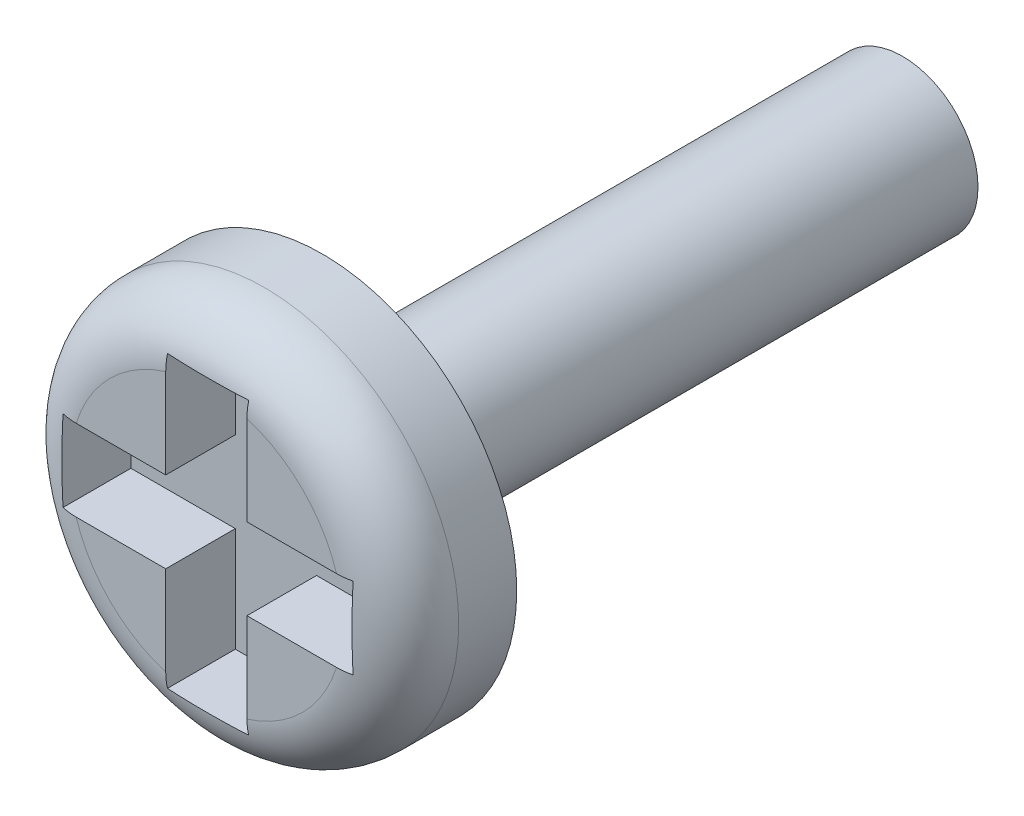
ISO-10303-21;
HEADER;
FILE_DESCRIPTION(('STEP AP214'),'2;1');
FILE_NAME('part.step','',(''),(''),'','','');
FILE_SCHEMA(('AUTOMOTIVE_DESIGN { 1 0 10303 214 1 1 1 1 }'));
ENDSEC;
DATA;
#1=APPLICATION_CONTEXT('core data for automotive mechanical design processes');
#2=APPLICATION_PROTOCOL_DEFINITION('international standard','automotive_design',2000,#1);
#3=PRODUCT_CONTEXT('',#1,'mechanical');
#4=PRODUCT('Part','Part','',(#3));
#5=PRODUCT_RELATED_PRODUCT_CATEGORY('part','',(#4));
#6=PRODUCT_DEFINITION_FORMATION('','',#4);
#7=PRODUCT_DEFINITION_CONTEXT('part definition',#1,'design');
#8=PRODUCT_DEFINITION('design','',#6,#7);
#9=PRODUCT_DEFINITION_SHAPE('','',#8);
#10=(LENGTH_UNIT() NAMED_UNIT(*) SI_UNIT(.MILLI.,.METRE.));
#11=(NAMED_UNIT(*) PLANE_ANGLE_UNIT() SI_UNIT($,.RADIAN.));
#12=(NAMED_UNIT(*) SI_UNIT($,.STERADIAN.) SOLID_ANGLE_UNIT());
#13=UNCERTAINTY_MEASURE_WITH_UNIT(LENGTH_MEASURE(1.E-05),#10,'distance_accuracy_value','');
#14=(GEOMETRIC_REPRESENTATION_CONTEXT(3) GLOBAL_UNCERTAINTY_ASSIGNED_CONTEXT((#13)) GLOBAL_UNIT_ASSIGNED_CONTEXT((#10,
#11,#12)) REPRESENTATION_CONTEXT('',''));
#15=CARTESIAN_POINT('',(0.,0.,0.));
#16=DIRECTION('',(0.,0.,1.));
#17=DIRECTION('',(1.,0.,0.));
#18=AXIS2_PLACEMENT_3D('',#15,#16,#17);
#19=CARTESIAN_POINT('',(0.,0.,6.));
#20=DIRECTION('',(0.,0.,1.));
#21=DIRECTION('',(1.,0.,0.));
#22=AXIS2_PLACEMENT_3D('',#19,#20,#21);
#23=PLANE('',#22);
#24=DIRECTION('',(0.,-1.,0.));
#25=VECTOR('',#24,1.);
#26=CARTESIAN_POINT('',(-0.35,0.35,6.));
#27=LINE('',#26,#25);
#28=CARTESIAN_POINT('',(-0.35,1.12166171370873,6.));
#29=VERTEX_POINT('',#28);
#30=CARTESIAN_POINT('',(-0.35,0.35,6.));
#31=VERTEX_POINT('',#30);
#32=EDGE_CURVE('E200',#29,#31,#27,.T.);
#33=ORIENTED_EDGE('',*,*,#32,.F.);
#34=CARTESIAN_POINT('',(0.,0.,6.));
#35=DIRECTION('',(0.,0.,1.));
#36=DIRECTION('',(1.,0.,0.));
#37=AXIS2_PLACEMENT_3D('',#34,#35,#36);
#38=CIRCLE('',#37,1.175);
#39=CARTESIAN_POINT('',(-1.12166171370873,0.35,6.));
#40=VERTEX_POINT('',#39);
#41=EDGE_CURVE('E259',#29,#40,#38,.T.);
#42=ORIENTED_EDGE('',*,*,#41,.T.);
#43=DIRECTION('',(-1.,0.,0.));
#44=VECTOR('',#43,1.);
#45=CARTESIAN_POINT('',(-1.25,0.35,6.));
#46=LINE('',#45,#44);
#47=EDGE_CURVE('E202',#31,#40,#46,.T.);
#48=ORIENTED_EDGE('',*,*,#47,.F.);
#49=EDGE_LOOP('',(#33,#42,#48));
#50=FACE_BOUND('',#49,.T.);
#51=ADVANCED_FACE('F34',(#50),#23,.T.);
#52=DIRECTION('',(1.,0.,0.));
#53=VECTOR('',#52,1.);
#54=CARTESIAN_POINT('',(-1.25,-0.35,6.));
#55=LINE('',#54,#53);
#56=CARTESIAN_POINT('',(-1.12166171370873,-0.35,6.));
#57=VERTEX_POINT('',#56);
#58=CARTESIAN_POINT('',(-0.35,-0.35,6.));
#59=VERTEX_POINT('',#58);
#60=EDGE_CURVE('E205',#57,#59,#55,.T.);
#61=ORIENTED_EDGE('',*,*,#60,.F.);
#62=CARTESIAN_POINT('',(0.,0.,6.));
#63=DIRECTION('',(0.,0.,1.));
#64=DIRECTION('',(1.,0.,0.));
#65=AXIS2_PLACEMENT_3D('',#62,#63,#64);
#66=CIRCLE('',#65,1.175);
#67=CARTESIAN_POINT('',(-0.35,-1.12166171370873,6.));
#68=VERTEX_POINT('',#67);
#69=EDGE_CURVE('E257',#57,#68,#66,.T.);
#70=ORIENTED_EDGE('',*,*,#69,.T.);
#71=DIRECTION('',(0.,-1.,0.));
#72=VECTOR('',#71,1.);
#73=CARTESIAN_POINT('',(-0.35,-1.25,6.));
#74=LINE('',#73,#72);
#75=EDGE_CURVE('E207',#59,#68,#74,.T.);
#76=ORIENTED_EDGE('',*,*,#75,.F.);
#77=EDGE_LOOP('',(#61,#70,#76));
#78=FACE_BOUND('',#77,.T.);
#79=ADVANCED_FACE('F339',(#78),#23,.T.);
#80=DIRECTION('',(0.,1.,0.));
#81=VECTOR('',#80,1.);
#82=CARTESIAN_POINT('',(0.35,-1.25,6.));
#83=LINE('',#82,#81);
#84=CARTESIAN_POINT('',(0.35,-1.12166171370873,6.));
#85=VERTEX_POINT('',#84);
#86=CARTESIAN_POINT('',(0.35,-0.35,6.));
#87=VERTEX_POINT('',#86);
#88=EDGE_CURVE('E210',#85,#87,#83,.T.);
#89=ORIENTED_EDGE('',*,*,#88,.F.);
#90=CARTESIAN_POINT('',(0.,0.,6.));
#91=DIRECTION('',(0.,0.,1.));
#92=DIRECTION('',(1.,0.,0.));
#93=AXIS2_PLACEMENT_3D('',#90,#91,#92);
#94=CIRCLE('',#93,1.175);
#95=CARTESIAN_POINT('',(1.12166171370873,-0.35,6.));
#96=VERTEX_POINT('',#95);
#97=EDGE_CURVE('E255',#85,#96,#94,.T.);
#98=ORIENTED_EDGE('',*,*,#97,.T.);
#99=DIRECTION('',(1.,0.,0.));
#100=VECTOR('',#99,1.);
#101=CARTESIAN_POINT('',(0.35,-0.35,6.));
#102=LINE('',#101,#100);
#103=EDGE_CURVE('E170',#87,#96,#102,.T.);
#104=ORIENTED_EDGE('',*,*,#103,.F.);
#105=EDGE_LOOP('',(#89,#98,#104));
#106=FACE_BOUND('',#105,.T.);
#107=ADVANCED_FACE('F323',(#106),#23,.T.);
#108=CARTESIAN_POINT('',(0.,0.,5.));
#109=DIRECTION('',(0.,0.,-1.));
#110=DIRECTION('',(-1.,0.,0.));
#111=AXIS2_PLACEMENT_3D('',#108,#109,#110);
#112=CYLINDRICAL_SURFACE('',#111,0.65);
#113=CARTESIAN_POINT('',(0.,0.,5.));
#114=DIRECTION('',(0.,0.,1.));
#115=DIRECTION('',(1.,0.,0.));
#116=AXIS2_PLACEMENT_3D('',#113,#114,#115);
#117=CIRCLE('',#116,0.65);
#118=CARTESIAN_POINT('',(0.65,0.,5.));
#119=VERTEX_POINT('',#118);
#120=EDGE_CURVE('E248',#119,#119,#117,.T.);
#121=ORIENTED_EDGE('',*,*,#120,.F.);
#122=EDGE_LOOP('',(#121));
#123=FACE_BOUND('',#122,.T.);
#124=CARTESIAN_POINT('',(0.,0.,0.));
#125=DIRECTION('',(0.,0.,1.));
#126=DIRECTION('',(1.,0.,0.));
#127=AXIS2_PLACEMENT_3D('',#124,#125,#126);
#128=CIRCLE('',#127,0.65);
#129=CARTESIAN_POINT('',(0.65,0.,0.));
#130=VERTEX_POINT('',#129);
#131=EDGE_CURVE('E247',#130,#130,#128,.T.);
#132=ORIENTED_EDGE('',*,*,#131,.T.);
#133=EDGE_LOOP('',(#132));
#134=FACE_BOUND('',#133,.T.);
#135=ADVANCED_FACE('F332',(#123,#134),#112,.T.);
#136=CARTESIAN_POINT('',(0.,0.,0.));
#137=DIRECTION('',(0.,0.,1.));
#138=DIRECTION('',(1.,0.,0.));
#139=AXIS2_PLACEMENT_3D('',#136,#137,#138);
#140=PLANE('',#139);
#141=ORIENTED_EDGE('',*,*,#131,.F.);
#142=EDGE_LOOP('',(#141));
#143=FACE_BOUND('',#142,.T.);
#144=ADVANCED_FACE('F329',(#143),#140,.F.);
#145=CARTESIAN_POINT('',(0.,0.,6.));
#146=DIRECTION('',(0.,0.,-1.));
#147=DIRECTION('',(-1.,0.,0.));
#148=AXIS2_PLACEMENT_3D('',#145,#146,#147);
#149=CYLINDRICAL_SURFACE('',#148,1.675);
#150=CARTESIAN_POINT('',(0.,0.,5.5));
#151=DIRECTION('',(0.,0.,1.));
#152=DIRECTION('',(1.,0.,0.));
#153=AXIS2_PLACEMENT_3D('',#150,#151,#152);
#154=CIRCLE('',#153,1.675);
#155=CARTESIAN_POINT('',(1.675,0.,5.5));
#156=VERTEX_POINT('',#155);
#157=EDGE_CURVE('E11',#156,#156,#154,.F.);
#158=ORIENTED_EDGE('',*,*,#157,.T.);
#159=EDGE_LOOP('',(#158));
#160=FACE_BOUND('',#159,.T.);
#161=CARTESIAN_POINT('',(0.,0.,5.));
#162=DIRECTION('',(0.,0.,1.));
#163=DIRECTION('',(1.,0.,0.));
#164=AXIS2_PLACEMENT_3D('',#161,#162,#163);
#165=CIRCLE('',#164,1.675);
#166=CARTESIAN_POINT('',(1.675,0.,5.));
#167=VERTEX_POINT('',#166);
#168=EDGE_CURVE('E216',#167,#167,#165,.T.);
#169=ORIENTED_EDGE('',*,*,#168,.T.);
#170=EDGE_LOOP('',(#169));
#171=FACE_BOUND('',#170,.T.);
#172=ADVANCED_FACE('F321',(#160,#171),#149,.T.);
#173=DIRECTION('',(-1.,0.,0.));
#174=VECTOR('',#173,1.);
#175=CARTESIAN_POINT('',(0.35,0.35,6.));
#176=LINE('',#175,#174);
#177=CARTESIAN_POINT('',(1.12166171370873,0.35,6.));
#178=VERTEX_POINT('',#177);
#179=CARTESIAN_POINT('',(0.35,0.35,6.));
#180=VERTEX_POINT('',#179);
#181=EDGE_CURVE('E168',#178,#180,#176,.T.);
#182=ORIENTED_EDGE('',*,*,#181,.F.);
#183=CARTESIAN_POINT('',(0.,0.,6.));
#184=DIRECTION('',(0.,0.,1.));
#185=DIRECTION('',(1.,0.,0.));
#186=AXIS2_PLACEMENT_3D('',#183,#184,#185);
#187=CIRCLE('',#186,1.175);
#188=CARTESIAN_POINT('',(0.35,1.12166171370873,6.));
#189=VERTEX_POINT('',#188);
#190=EDGE_CURVE('E251',#178,#189,#187,.T.);
#191=ORIENTED_EDGE('',*,*,#190,.T.);
#192=DIRECTION('',(0.,1.,0.));
#193=VECTOR('',#192,1.);
#194=CARTESIAN_POINT('',(0.35,0.35,6.));
#195=LINE('',#194,#193);
#196=EDGE_CURVE('E198',#180,#189,#195,.T.);
#197=ORIENTED_EDGE('',*,*,#196,.F.);
#198=EDGE_LOOP('',(#182,#191,#197));
#199=FACE_BOUND('',#198,.T.);
#200=ADVANCED_FACE('F318',(#199),#23,.T.);
#201=CARTESIAN_POINT('',(0.,0.,5.));
#202=DIRECTION('',(0.,0.,1.));
#203=DIRECTION('',(1.,0.,0.));
#204=AXIS2_PLACEMENT_3D('',#201,#202,#203);
#205=PLANE('',#204);
#206=ORIENTED_EDGE('',*,*,#120,.T.);
#207=EDGE_LOOP('',(#206));
#208=FACE_BOUND('',#207,.T.);
#209=ORIENTED_EDGE('',*,*,#168,.F.);
#210=EDGE_LOOP('',(#209));
#211=FACE_BOUND('',#210,.T.);
#212=ADVANCED_FACE('F317',(#208,#211),#205,.F.);
#213=CARTESIAN_POINT('',(0.35,0.35,5.4));
#214=DIRECTION('',(1.,0.,0.));
#215=DIRECTION('',(0.,0.,-1.));
#216=AXIS2_PLACEMENT_3D('',#213,#214,#215);
#217=PLANE('',#216);
#218=ORIENTED_EDGE('',*,*,#196,.T.);
#219=CARTESIAN_POINT('',(0.35,1.12166171370873,6.));
#220=CARTESIAN_POINT('',(0.35,1.14335896950557,6.00000418723951));
#221=CARTESIAN_POINT('',(0.35,1.16490230066648,5.99872429719805));
#222=CARTESIAN_POINT('',(0.35,1.2076817384215,5.99359628766923));
#223=CARTESIAN_POINT('',(0.35,1.22891783602435,5.98974809317452));
#224=CARTESIAN_POINT('',(0.35,1.25,5.98461574639149));
#225=B_SPLINE_CURVE_WITH_KNOTS('',3,(#219,#220,#221,#222,#223,#224),.UNSPECIFIED.,.F.,.F.,(4,2,
4),(0.,0.0647439504837291,0.129489791897699),.UNSPECIFIED.);
#226=CARTESIAN_POINT('',(0.35,1.25,5.98461574639149));
#227=VERTEX_POINT('',#226);
#228=EDGE_CURVE('E58',#189,#227,#225,.T.);
#229=ORIENTED_EDGE('',*,*,#228,.T.);
#230=DIRECTION('',(0.,0.,1.));
#231=VECTOR('',#230,1.);
#232=CARTESIAN_POINT('',(0.35,1.25,5.4));
#233=LINE('',#232,#231);
#234=CARTESIAN_POINT('',(0.35,1.25,5.4));
#235=VERTEX_POINT('',#234);
#236=EDGE_CURVE('E147',#235,#227,#233,.T.);
#237=ORIENTED_EDGE('',*,*,#236,.F.);
#238=DIRECTION('',(0.,1.,0.));
#239=VECTOR('',#238,1.);
#240=CARTESIAN_POINT('',(0.35,0.35,5.4));
#241=LINE('',#240,#239);
#242=CARTESIAN_POINT('',(0.35,0.35,5.4));
#243=VERTEX_POINT('',#242);
#244=EDGE_CURVE('E152',#243,#235,#241,.T.);
#245=ORIENTED_EDGE('',*,*,#244,.F.);
#246=DIRECTION('',(0.,0.,1.));
#247=VECTOR('',#246,1.);
#248=CARTESIAN_POINT('',(0.35,0.35,5.4));
#249=LINE('',#248,#247);
#250=EDGE_CURVE('E214',#243,#180,#249,.T.);
#251=ORIENTED_EDGE('',*,*,#250,.T.);
#252=EDGE_LOOP('',(#218,#229,#237,#245,#251));
#253=FACE_BOUND('',#252,.T.);
#254=ADVANCED_FACE('F149',(#253),#217,.F.);
#255=CARTESIAN_POINT('',(0.35,0.35,5.4));
#256=DIRECTION('',(0.,1.,0.));
#257=DIRECTION('',(-1.,0.,0.));
#258=AXIS2_PLACEMENT_3D('',#255,#256,#257);
#259=PLANE('',#258);
#260=DIRECTION('',(0.,0.,1.));
#261=VECTOR('',#260,1.);
#262=CARTESIAN_POINT('',(1.25,0.35,5.4));
#263=LINE('',#262,#261);
#264=CARTESIAN_POINT('',(1.25,0.35,5.4));
#265=VERTEX_POINT('',#264);
#266=CARTESIAN_POINT('',(1.25,0.35,5.98461574639149));
#267=VERTEX_POINT('',#266);
#268=EDGE_CURVE('E217',#265,#267,#263,.T.);
#269=ORIENTED_EDGE('',*,*,#268,.T.);
#270=CARTESIAN_POINT('',(1.25,0.35,5.98461574639149));
#271=CARTESIAN_POINT('',(1.22891783602435,0.35,5.98974809317452));
#272=CARTESIAN_POINT('',(1.2076817384215,0.35,5.99359628766923));
#273=CARTESIAN_POINT('',(1.16490230066648,0.35,5.99872429719805));
#274=CARTESIAN_POINT('',(1.14335896950557,0.35,6.00000418723951));
#275=CARTESIAN_POINT('',(1.12166171370873,0.35,6.));
#276=B_SPLINE_CURVE_WITH_KNOTS('',3,(#270,#271,#272,#273,#274,#275),.UNSPECIFIED.,.F.,.F.,(4,2,
4),(0.,0.0647458414139704,0.1294897918977),.UNSPECIFIED.);
#277=EDGE_CURVE('E306',#267,#178,#276,.T.);
#278=ORIENTED_EDGE('',*,*,#277,.T.);
#279=ORIENTED_EDGE('',*,*,#181,.T.);
#280=ORIENTED_EDGE('',*,*,#250,.F.);
#281=DIRECTION('',(-1.,0.,0.));
#282=VECTOR('',#281,1.);
#283=CARTESIAN_POINT('',(0.35,0.35,5.4));
#284=LINE('',#283,#282);
#285=EDGE_CURVE('E155',#265,#243,#284,.T.);
#286=ORIENTED_EDGE('',*,*,#285,.F.);
#287=EDGE_LOOP('',(#269,#278,#279,#280,#286));
#288=FACE_BOUND('',#287,.T.);
#289=ADVANCED_FACE('F316',(#288),#259,.F.);
#290=CARTESIAN_POINT('',(1.25,-0.35,5.4));
#291=DIRECTION('',(1.,0.,0.));
#292=DIRECTION('',(0.,0.,-1.));
#293=AXIS2_PLACEMENT_3D('',#290,#291,#292);
#294=PLANE('',#293);
#295=DIRECTION('',(0.,0.,1.));
#296=VECTOR('',#295,1.);
#297=CARTESIAN_POINT('',(1.25,-0.35,5.4));
#298=LINE('',#297,#296);
#299=CARTESIAN_POINT('',(1.25,-0.35,5.4));
#300=VERTEX_POINT('',#299);
#301=CARTESIAN_POINT('',(1.25,-0.35,5.98461574639149));
#302=VERTEX_POINT('',#301);
#303=EDGE_CURVE('E220',#300,#302,#298,.T.);
#304=ORIENTED_EDGE('',*,*,#303,.T.);
#305=CARTESIAN_POINT('',(1.25,-0.35,5.98461574639149));
#306=CARTESIAN_POINT('',(1.25,-0.320866230688018,5.98659960527539));
#307=CARTESIAN_POINT('',(1.25,-0.291709277356246,5.98817253020906));
#308=CARTESIAN_POINT('',(1.25,-0.23337331377446,5.99068415808697));
#309=CARTESIAN_POINT('',(1.25,-0.204194309203481,5.99162298971256));
#310=CARTESIAN_POINT('',(1.25,-0.14584910129758,5.99305418052429));
#311=CARTESIAN_POINT('',(1.25,-0.116682905316608,5.9935468816973));
#312=CARTESIAN_POINT('',(1.25,-0.0583444730897005,5.99419130454631));
#313=CARTESIAN_POINT('',(1.25,-0.0291722365448503,5.99434299833224));
#314=CARTESIAN_POINT('',(1.25,0.0291722365448499,5.99434299833224));
#315=CARTESIAN_POINT('',(1.25,0.0583444730897001,5.99419130454631));
#316=CARTESIAN_POINT('',(1.25,0.116682905316607,5.9935468816973));
#317=CARTESIAN_POINT('',(1.25,0.14584910129758,5.99305418052429));
#318=CARTESIAN_POINT('',(1.25,0.204194309203481,5.99162298971256));
#319=CARTESIAN_POINT('',(1.25,0.233373313774459,5.99068415808697));
#320=CARTESIAN_POINT('',(1.25,0.291709277356245,5.98817253020906));
#321=CARTESIAN_POINT('',(1.25,0.320866230688018,5.98659960527539));
#322=CARTESIAN_POINT('',(1.25,0.35,5.98461574639149));
#323=B_SPLINE_CURVE_WITH_KNOTS('',3,(#305,#306,#307,#308,#309,#310,#311,#312,#313,#314,#315,
#316,#317,#318,#319,#320,#321,#322),.UNSPECIFIED.,.F.,.F.,(4,2,2,2,2,2,2,2,4),(0.,
0.0875939793309114,0.175170177208738,0.262679185485056,0.350195350624555,0.437711515764054,
0.525220524040373,0.612796721918199,0.700390701249111),.UNSPECIFIED.);
#324=EDGE_CURVE('E393',#302,#267,#323,.T.);
#325=ORIENTED_EDGE('',*,*,#324,.T.);
#326=ORIENTED_EDGE('',*,*,#268,.F.);
#327=DIRECTION('',(0.,1.,0.));
#328=VECTOR('',#327,1.);
#329=CARTESIAN_POINT('',(1.25,-0.35,5.4));
#330=LINE('',#329,#328);
#331=EDGE_CURVE('E195',#300,#265,#330,.T.);
#332=ORIENTED_EDGE('',*,*,#331,.F.);
#333=EDGE_LOOP('',(#304,#325,#326,#332));
#334=FACE_BOUND('',#333,.T.);
#335=ADVANCED_FACE('F387',(#334),#294,.F.);
#336=CARTESIAN_POINT('',(0.35,-0.35,5.4));
#337=DIRECTION('',(0.,-1.,0.));
#338=DIRECTION('',(1.,0.,0.));
#339=AXIS2_PLACEMENT_3D('',#336,#337,#338);
#340=PLANE('',#339);
#341=ORIENTED_EDGE('',*,*,#103,.T.);
#342=CARTESIAN_POINT('',(1.12166171370873,-0.35,6.));
#343=CARTESIAN_POINT('',(1.14335896950557,-0.35,6.00000418723951));
#344=CARTESIAN_POINT('',(1.16490230066648,-0.35,5.99872429719805));
#345=CARTESIAN_POINT('',(1.2076817384215,-0.35,5.99359628766923));
#346=CARTESIAN_POINT('',(1.22891783602435,-0.35,5.98974809317452));
#347=CARTESIAN_POINT('',(1.25,-0.35,5.98461574639149));
#348=B_SPLINE_CURVE_WITH_KNOTS('',3,(#342,#343,#344,#345,#346,#347),.UNSPECIFIED.,.F.,.F.,(4,2,
4),(0.,0.0647439504837293,0.1294897918977),.UNSPECIFIED.);
#349=EDGE_CURVE('E384',#96,#302,#348,.T.);
#350=ORIENTED_EDGE('',*,*,#349,.T.);
#351=ORIENTED_EDGE('',*,*,#303,.F.);
#352=DIRECTION('',(1.,0.,0.));
#353=VECTOR('',#352,1.);
#354=CARTESIAN_POINT('',(0.35,-0.35,5.4));
#355=LINE('',#354,#353);
#356=CARTESIAN_POINT('',(0.35,-0.35,5.4));
#357=VERTEX_POINT('',#356);
#358=EDGE_CURVE('E192',#357,#300,#355,.T.);
#359=ORIENTED_EDGE('',*,*,#358,.F.);
#360=DIRECTION('',(0.,0.,1.));
#361=VECTOR('',#360,1.);
#362=CARTESIAN_POINT('',(0.35,-0.35,5.4));
#363=LINE('',#362,#361);
#364=EDGE_CURVE('E223',#357,#87,#363,.T.);
#365=ORIENTED_EDGE('',*,*,#364,.T.);
#366=EDGE_LOOP('',(#341,#350,#351,#359,#365));
#367=FACE_BOUND('',#366,.T.);
#368=ADVANCED_FACE('F381',(#367),#340,.F.);
#369=CARTESIAN_POINT('',(0.35,-1.25,5.4));
#370=DIRECTION('',(1.,0.,0.));
#371=DIRECTION('',(0.,1.,0.));
#372=AXIS2_PLACEMENT_3D('',#369,#370,#371);
#373=PLANE('',#372);
#374=DIRECTION('',(0.,0.,1.));
#375=VECTOR('',#374,1.);
#376=CARTESIAN_POINT('',(0.35,-1.25,5.4));
#377=LINE('',#376,#375);
#378=CARTESIAN_POINT('',(0.35,-1.25,5.4));
#379=VERTEX_POINT('',#378);
#380=CARTESIAN_POINT('',(0.35,-1.25,5.98461574639149));
#381=VERTEX_POINT('',#380);
#382=EDGE_CURVE('E226',#379,#381,#377,.T.);
#383=ORIENTED_EDGE('',*,*,#382,.T.);
#384=CARTESIAN_POINT('',(0.35,-1.25,5.98461574639149));
#385=CARTESIAN_POINT('',(0.35,-1.22891783602435,5.98974809317452));
#386=CARTESIAN_POINT('',(0.35,-1.2076817384215,5.99359628766923));
#387=CARTESIAN_POINT('',(0.35,-1.16490230066648,5.99872429719805));
#388=CARTESIAN_POINT('',(0.35,-1.14335896950557,6.00000418723951));
#389=CARTESIAN_POINT('',(0.35,-1.12166171370873,6.));
#390=B_SPLINE_CURVE_WITH_KNOTS('',3,(#384,#385,#386,#387,#388,#389),.UNSPECIFIED.,.F.,.F.,(4,2,
4),(0.,0.0647458414139708,0.129489791897701),.UNSPECIFIED.);
#391=EDGE_CURVE('E394',#381,#85,#390,.T.);
#392=ORIENTED_EDGE('',*,*,#391,.T.);
#393=ORIENTED_EDGE('',*,*,#88,.T.);
#394=ORIENTED_EDGE('',*,*,#364,.F.);
#395=DIRECTION('',(0.,1.,0.));
#396=VECTOR('',#395,1.);
#397=CARTESIAN_POINT('',(0.35,-1.25,5.4));
#398=LINE('',#397,#396);
#399=EDGE_CURVE('E189',#379,#357,#398,.T.);
#400=ORIENTED_EDGE('',*,*,#399,.F.);
#401=EDGE_LOOP('',(#383,#392,#393,#394,#400));
#402=FACE_BOUND('',#401,.T.);
#403=ADVANCED_FACE('F376',(#402),#373,.F.);
#404=CARTESIAN_POINT('',(-0.35,-1.25,5.4));
#405=DIRECTION('',(0.,-1.,0.));
#406=DIRECTION('',(0.,0.,-1.));
#407=AXIS2_PLACEMENT_3D('',#404,#405,#406);
#408=PLANE('',#407);
#409=DIRECTION('',(0.,0.,1.));
#410=VECTOR('',#409,1.);
#411=CARTESIAN_POINT('',(-0.35,-1.25,5.4));
#412=LINE('',#411,#410);
#413=CARTESIAN_POINT('',(-0.35,-1.25,5.4));
#414=VERTEX_POINT('',#413);
#415=CARTESIAN_POINT('',(-0.35,-1.25,5.98461574639149));
#416=VERTEX_POINT('',#415);
#417=EDGE_CURVE('E229',#414,#416,#412,.T.);
#418=ORIENTED_EDGE('',*,*,#417,.T.);
#419=CARTESIAN_POINT('',(-0.35,-1.25,5.98461574639149));
#420=CARTESIAN_POINT('',(-0.320866230688018,-1.25,5.98659960527539));
#421=CARTESIAN_POINT('',(-0.291709277356246,-1.25,5.98817253020906));
#422=CARTESIAN_POINT('',(-0.23337331377446,-1.25,5.99068415808697));
#423=CARTESIAN_POINT('',(-0.204194309203481,-1.25,5.99162298971256));
#424=CARTESIAN_POINT('',(-0.14584910129758,-1.25,5.99305418052429));
#425=CARTESIAN_POINT('',(-0.116682905316608,-1.25,5.9935468816973));
#426=CARTESIAN_POINT('',(-0.0583444730897004,-1.25,5.99419130454631));
#427=CARTESIAN_POINT('',(-0.0291722365448503,-1.25,5.99434299833224));
#428=CARTESIAN_POINT('',(0.02917223654485,-1.25,5.99434299833224));
#429=CARTESIAN_POINT('',(0.0583444730897002,-1.25,5.99419130454631));
#430=CARTESIAN_POINT('',(0.116682905316607,-1.25,5.9935468816973));
#431=CARTESIAN_POINT('',(0.14584910129758,-1.25,5.99305418052429));
#432=CARTESIAN_POINT('',(0.204194309203481,-1.25,5.99162298971256));
#433=CARTESIAN_POINT('',(0.23337331377446,-1.25,5.99068415808697));
#434=CARTESIAN_POINT('',(0.291709277356246,-1.25,5.98817253020906));
#435=CARTESIAN_POINT('',(0.320866230688018,-1.25,5.98659960527539));
#436=CARTESIAN_POINT('',(0.35,-1.25,5.98461574639149));
#437=B_SPLINE_CURVE_WITH_KNOTS('',3,(#419,#420,#421,#422,#423,#424,#425,#426,#427,#428,#429,
#430,#431,#432,#433,#434,#435,#436),.UNSPECIFIED.,.F.,.F.,(4,2,2,2,2,2,2,2,4),(0.,
0.0875939793309113,0.175170177208738,0.262679185485056,0.350195350624555,0.437711515764054,
0.525220524040373,0.612796721918199,0.700390701249111),.UNSPECIFIED.);
#438=EDGE_CURVE('E424',#416,#381,#437,.T.);
#439=ORIENTED_EDGE('',*,*,#438,.T.);
#440=ORIENTED_EDGE('',*,*,#382,.F.);
#441=DIRECTION('',(1.,0.,0.));
#442=VECTOR('',#441,1.);
#443=CARTESIAN_POINT('',(-0.35,-1.25,5.4));
#444=LINE('',#443,#442);
#445=EDGE_CURVE('E186',#414,#379,#444,.T.);
#446=ORIENTED_EDGE('',*,*,#445,.F.);
#447=EDGE_LOOP('',(#418,#439,#440,#446));
#448=FACE_BOUND('',#447,.T.);
#449=ADVANCED_FACE('F372',(#448),#408,.F.);
#450=CARTESIAN_POINT('',(-0.35,-1.25,5.4));
#451=DIRECTION('',(-1.,0.,0.));
#452=DIRECTION('',(0.,0.,1.));
#453=AXIS2_PLACEMENT_3D('',#450,#451,#452);
#454=PLANE('',#453);
#455=ORIENTED_EDGE('',*,*,#75,.T.);
#456=CARTESIAN_POINT('',(-0.35,-1.12166171370873,6.));
#457=CARTESIAN_POINT('',(-0.35,-1.14335896950557,6.00000418723951));
#458=CARTESIAN_POINT('',(-0.35,-1.16490230066648,5.99872429719805));
#459=CARTESIAN_POINT('',(-0.35,-1.2076817384215,5.99359628766923));
#460=CARTESIAN_POINT('',(-0.35,-1.22891783602435,5.98974809317452));
#461=CARTESIAN_POINT('',(-0.35,-1.25,5.98461574639149));
#462=B_SPLINE_CURVE_WITH_KNOTS('',3,(#456,#457,#458,#459,#460,#461),.UNSPECIFIED.,.F.,.F.,(4,2,
4),(0.,0.0647439504837295,0.1294897918977),.UNSPECIFIED.);
#463=EDGE_CURVE('E369',#68,#416,#462,.T.);
#464=ORIENTED_EDGE('',*,*,#463,.T.);
#465=ORIENTED_EDGE('',*,*,#417,.F.);
#466=DIRECTION('',(0.,-1.,0.));
#467=VECTOR('',#466,1.);
#468=CARTESIAN_POINT('',(-0.35,-1.25,5.4));
#469=LINE('',#468,#467);
#470=CARTESIAN_POINT('',(-0.35,-0.35,5.4));
#471=VERTEX_POINT('',#470);
#472=EDGE_CURVE('E183',#471,#414,#469,.T.);
#473=ORIENTED_EDGE('',*,*,#472,.F.);
#474=DIRECTION('',(0.,0.,1.));
#475=VECTOR('',#474,1.);
#476=CARTESIAN_POINT('',(-0.35,-0.35,5.4));
#477=LINE('',#476,#475);
#478=EDGE_CURVE('E232',#471,#59,#477,.T.);
#479=ORIENTED_EDGE('',*,*,#478,.T.);
#480=EDGE_LOOP('',(#455,#464,#465,#473,#479));
#481=FACE_BOUND('',#480,.T.);
#482=ADVANCED_FACE('F366',(#481),#454,.F.);
#483=CARTESIAN_POINT('',(-1.25,-0.35,5.4));
#484=DIRECTION('',(0.,-1.,0.));
#485=DIRECTION('',(1.,0.,0.));
#486=AXIS2_PLACEMENT_3D('',#483,#484,#485);
#487=PLANE('',#486);
#488=DIRECTION('',(0.,0.,1.));
#489=VECTOR('',#488,1.);
#490=CARTESIAN_POINT('',(-1.25,-0.35,5.4));
#491=LINE('',#490,#489);
#492=CARTESIAN_POINT('',(-1.25,-0.35,5.4));
#493=VERTEX_POINT('',#492);
#494=CARTESIAN_POINT('',(-1.25,-0.35,5.98461574639149));
#495=VERTEX_POINT('',#494);
#496=EDGE_CURVE('E235',#493,#495,#491,.T.);
#497=ORIENTED_EDGE('',*,*,#496,.T.);
#498=CARTESIAN_POINT('',(-1.25,-0.35,5.98461574639149));
#499=CARTESIAN_POINT('',(-1.22891783602435,-0.35,5.98974809317452));
#500=CARTESIAN_POINT('',(-1.2076817384215,-0.35,5.99359628766923));
#501=CARTESIAN_POINT('',(-1.16490230066648,-0.35,5.99872429719805));
#502=CARTESIAN_POINT('',(-1.14335896950557,-0.35,6.00000418723951));
#503=CARTESIAN_POINT('',(-1.12166171370873,-0.35,6.));
#504=B_SPLINE_CURVE_WITH_KNOTS('',3,(#498,#499,#500,#501,#502,#503),.UNSPECIFIED.,.F.,.F.,(4,2,
4),(0.,0.0647458414139706,0.1294897918977),.UNSPECIFIED.);
#505=EDGE_CURVE('E434',#495,#57,#504,.T.);
#506=ORIENTED_EDGE('',*,*,#505,.T.);
#507=ORIENTED_EDGE('',*,*,#60,.T.);
#508=ORIENTED_EDGE('',*,*,#478,.F.);
#509=DIRECTION('',(1.,0.,0.));
#510=VECTOR('',#509,1.);
#511=CARTESIAN_POINT('',(-1.25,-0.35,5.4));
#512=LINE('',#511,#510);
#513=EDGE_CURVE('E180',#493,#471,#512,.T.);
#514=ORIENTED_EDGE('',*,*,#513,.F.);
#515=EDGE_LOOP('',(#497,#506,#507,#508,#514));
#516=FACE_BOUND('',#515,.T.);
#517=ADVANCED_FACE('F362',(#516),#487,.F.);
#518=CARTESIAN_POINT('',(-1.25,-0.35,5.4));
#519=DIRECTION('',(-1.,0.,0.));
#520=DIRECTION('',(0.,0.,1.));
#521=AXIS2_PLACEMENT_3D('',#518,#519,#520);
#522=PLANE('',#521);
#523=DIRECTION('',(0.,0.,1.));
#524=VECTOR('',#523,1.);
#525=CARTESIAN_POINT('',(-1.25,0.35,5.4));
#526=LINE('',#525,#524);
#527=CARTESIAN_POINT('',(-1.25,0.35,5.4));
#528=VERTEX_POINT('',#527);
#529=CARTESIAN_POINT('',(-1.25,0.35,5.98461574639149));
#530=VERTEX_POINT('',#529);
#531=EDGE_CURVE('E238',#528,#530,#526,.T.);
#532=ORIENTED_EDGE('',*,*,#531,.T.);
#533=CARTESIAN_POINT('',(-1.25,0.35,5.98461574639149));
#534=CARTESIAN_POINT('',(-1.25,0.320866230688018,5.98659960527539));
#535=CARTESIAN_POINT('',(-1.25,0.291709277356246,5.98817253020906));
#536=CARTESIAN_POINT('',(-1.25,0.23337331377446,5.99068415808697));
#537=CARTESIAN_POINT('',(-1.25,0.204194309203481,5.99162298971256));
#538=CARTESIAN_POINT('',(-1.25,0.14584910129758,5.99305418052429));
#539=CARTESIAN_POINT('',(-1.25,0.116682905316607,5.9935468816973));
#540=CARTESIAN_POINT('',(-1.25,0.0583444730897003,5.99419130454631));
#541=CARTESIAN_POINT('',(-1.25,0.0291722365448501,5.99434299833224));
#542=CARTESIAN_POINT('',(-1.25,-0.0291722365448502,5.99434299833224));
#543=CARTESIAN_POINT('',(-1.25,-0.0583444730897003,5.99419130454631));
#544=CARTESIAN_POINT('',(-1.25,-0.116682905316607,5.9935468816973));
#545=CARTESIAN_POINT('',(-1.25,-0.14584910129758,5.99305418052429));
#546=CARTESIAN_POINT('',(-1.25,-0.204194309203481,5.99162298971256));
#547=CARTESIAN_POINT('',(-1.25,-0.23337331377446,5.99068415808697));
#548=CARTESIAN_POINT('',(-1.25,-0.291709277356246,5.98817253020906));
#549=CARTESIAN_POINT('',(-1.25,-0.320866230688018,5.98659960527539));
#550=CARTESIAN_POINT('',(-1.25,-0.35,5.98461574639149));
#551=B_SPLINE_CURVE_WITH_KNOTS('',3,(#533,#534,#535,#536,#537,#538,#539,#540,#541,#542,#543,
#544,#545,#546,#547,#548,#549,#550),.UNSPECIFIED.,.F.,.F.,(4,2,2,2,2,2,2,2,4),(0.,
0.0875939793309114,0.175170177208738,0.262679185485056,0.350195350624555,0.437711515764054,
0.525220524040373,0.612796721918199,0.700390701249111),.UNSPECIFIED.);
#552=EDGE_CURVE('E269',#530,#495,#551,.T.);
#553=ORIENTED_EDGE('',*,*,#552,.T.);
#554=ORIENTED_EDGE('',*,*,#496,.F.);
#555=DIRECTION('',(0.,-1.,0.));
#556=VECTOR('',#555,1.);
#557=CARTESIAN_POINT('',(-1.25,-0.35,5.4));
#558=LINE('',#557,#556);
#559=EDGE_CURVE('E177',#528,#493,#558,.T.);
#560=ORIENTED_EDGE('',*,*,#559,.F.);
#561=EDGE_LOOP('',(#532,#553,#554,#560));
#562=FACE_BOUND('',#561,.T.);
#563=ADVANCED_FACE('F281',(#562),#522,.F.);
#564=CARTESIAN_POINT('',(-1.25,0.35,5.4));
#565=DIRECTION('',(0.,1.,0.));
#566=DIRECTION('',(-1.,0.,0.));
#567=AXIS2_PLACEMENT_3D('',#564,#565,#566);
#568=PLANE('',#567);
#569=ORIENTED_EDGE('',*,*,#47,.T.);
#570=CARTESIAN_POINT('',(-1.12166171370873,0.35,6.));
#571=CARTESIAN_POINT('',(-1.14335896950557,0.35,6.00000418723951));
#572=CARTESIAN_POINT('',(-1.16490230066648,0.35,5.99872429719805));
#573=CARTESIAN_POINT('',(-1.2076817384215,0.35,5.99359628766923));
#574=CARTESIAN_POINT('',(-1.22891783602435,0.35,5.98974809317452));
#575=CARTESIAN_POINT('',(-1.25,0.35,5.98461574639149));
#576=B_SPLINE_CURVE_WITH_KNOTS('',3,(#570,#571,#572,#573,#574,#575),.UNSPECIFIED.,.F.,.F.,(4,2,
4),(0.,0.0647439504837293,0.1294897918977),.UNSPECIFIED.);
#577=EDGE_CURVE('E262',#40,#530,#576,.T.);
#578=ORIENTED_EDGE('',*,*,#577,.T.);
#579=ORIENTED_EDGE('',*,*,#531,.F.);
#580=DIRECTION('',(-1.,0.,0.));
#581=VECTOR('',#580,1.);
#582=CARTESIAN_POINT('',(-1.25,0.35,5.4));
#583=LINE('',#582,#581);
#584=CARTESIAN_POINT('',(-0.35,0.35,5.4));
#585=VERTEX_POINT('',#584);
#586=EDGE_CURVE('E174',#585,#528,#583,.T.);
#587=ORIENTED_EDGE('',*,*,#586,.F.);
#588=DIRECTION('',(0.,0.,1.));
#589=VECTOR('',#588,1.);
#590=CARTESIAN_POINT('',(-0.35,0.35,5.4));
#591=LINE('',#590,#589);
#592=EDGE_CURVE('E241',#585,#31,#591,.T.);
#593=ORIENTED_EDGE('',*,*,#592,.T.);
#594=EDGE_LOOP('',(#569,#578,#579,#587,#593));
#595=FACE_BOUND('',#594,.T.);
#596=ADVANCED_FACE('F276',(#595),#568,.F.);
#597=CARTESIAN_POINT('',(-0.35,0.35,5.4));
#598=DIRECTION('',(-1.,0.,0.));
#599=DIRECTION('',(0.,0.,1.));
#600=AXIS2_PLACEMENT_3D('',#597,#598,#599);
#601=PLANE('',#600);
#602=DIRECTION('',(0.,0.,1.));
#603=VECTOR('',#602,1.);
#604=CARTESIAN_POINT('',(-0.35,1.25,5.4));
#605=LINE('',#604,#603);
#606=CARTESIAN_POINT('',(-0.35,1.25,5.4));
#607=VERTEX_POINT('',#606);
#608=CARTESIAN_POINT('',(-0.35,1.25,5.98461574639149));
#609=VERTEX_POINT('',#608);
#610=EDGE_CURVE('E154',#607,#609,#605,.T.);
#611=ORIENTED_EDGE('',*,*,#610,.T.);
#612=CARTESIAN_POINT('',(-0.35,1.25,5.98461574639149));
#613=CARTESIAN_POINT('',(-0.35,1.22891783602435,5.98974809317452));
#614=CARTESIAN_POINT('',(-0.35,1.2076817384215,5.99359628766923));
#615=CARTESIAN_POINT('',(-0.35,1.16490230066648,5.99872429719805));
#616=CARTESIAN_POINT('',(-0.35,1.14335896950557,6.00000418723951));
#617=CARTESIAN_POINT('',(-0.35,1.12166171370873,6.));
#618=B_SPLINE_CURVE_WITH_KNOTS('',3,(#612,#613,#614,#615,#616,#617),.UNSPECIFIED.,.F.,.F.,(4,2,
4),(0.,0.0647458414139702,0.1294897918977),.UNSPECIFIED.);
#619=EDGE_CURVE('E43',#609,#29,#618,.T.);
#620=ORIENTED_EDGE('',*,*,#619,.T.);
#621=ORIENTED_EDGE('',*,*,#32,.T.);
#622=ORIENTED_EDGE('',*,*,#592,.F.);
#623=DIRECTION('',(0.,-1.,0.));
#624=VECTOR('',#623,1.);
#625=CARTESIAN_POINT('',(-0.35,0.35,5.4));
#626=LINE('',#625,#624);
#627=EDGE_CURVE('E163',#607,#585,#626,.T.);
#628=ORIENTED_EDGE('',*,*,#627,.F.);
#629=EDGE_LOOP('',(#611,#620,#621,#622,#628));
#630=FACE_BOUND('',#629,.T.);
#631=ADVANCED_FACE('F280',(#630),#601,.F.);
#632=CARTESIAN_POINT('',(-0.35,1.25,5.4));
#633=DIRECTION('',(0.,1.,0.));
#634=DIRECTION('',(0.,0.,1.));
#635=AXIS2_PLACEMENT_3D('',#632,#633,#634);
#636=PLANE('',#635);
#637=ORIENTED_EDGE('',*,*,#236,.T.);
#638=CARTESIAN_POINT('',(0.35,1.25,5.98461574639149));
#639=CARTESIAN_POINT('',(0.320866230688018,1.25,5.98659960527539));
#640=CARTESIAN_POINT('',(0.291709277356246,1.25,5.98817253020906));
#641=CARTESIAN_POINT('',(0.23337331377446,1.25,5.99068415808697));
#642=CARTESIAN_POINT('',(0.204194309203481,1.25,5.99162298971256));
#643=CARTESIAN_POINT('',(0.14584910129758,1.25,5.99305418052429));
#644=CARTESIAN_POINT('',(0.116682905316607,1.25,5.9935468816973));
#645=CARTESIAN_POINT('',(0.0583444730897003,1.25,5.99419130454631));
#646=CARTESIAN_POINT('',(0.0291722365448501,1.25,5.99434299833224));
#647=CARTESIAN_POINT('',(-0.0291722365448502,1.25,5.99434299833224));
#648=CARTESIAN_POINT('',(-0.0583444730897004,1.25,5.99419130454631));
#649=CARTESIAN_POINT('',(-0.116682905316607,1.25,5.9935468816973));
#650=CARTESIAN_POINT('',(-0.14584910129758,1.25,5.99305418052429));
#651=CARTESIAN_POINT('',(-0.204194309203481,1.25,5.99162298971256));
#652=CARTESIAN_POINT('',(-0.23337331377446,1.25,5.99068415808697));
#653=CARTESIAN_POINT('',(-0.291709277356246,1.25,5.98817253020906));
#654=CARTESIAN_POINT('',(-0.320866230688018,1.25,5.98659960527539));
#655=CARTESIAN_POINT('',(-0.35,1.25,5.98461574639149));
#656=B_SPLINE_CURVE_WITH_KNOTS('',3,(#638,#639,#640,#641,#642,#643,#644,#645,#646,#647,#648,
#649,#650,#651,#652,#653,#654,#655),.UNSPECIFIED.,.F.,.F.,(4,2,2,2,2,2,2,2,4),(0.,
0.0875939793309113,0.175170177208738,0.262679185485056,0.350195350624555,0.437711515764054,
0.525220524040373,0.612796721918199,0.700390701249111),.UNSPECIFIED.);
#657=EDGE_CURVE('E50',#227,#609,#656,.T.);
#658=ORIENTED_EDGE('',*,*,#657,.T.);
#659=ORIENTED_EDGE('',*,*,#610,.F.);
#660=DIRECTION('',(-1.,0.,0.));
#661=VECTOR('',#660,1.);
#662=CARTESIAN_POINT('',(-0.35,1.25,5.4));
#663=LINE('',#662,#661);
#664=EDGE_CURVE('E158',#235,#607,#663,.T.);
#665=ORIENTED_EDGE('',*,*,#664,.F.);
#666=EDGE_LOOP('',(#637,#658,#659,#665));
#667=FACE_BOUND('',#666,.T.);
#668=ADVANCED_FACE('F159',(#667),#636,.F.);
#669=CARTESIAN_POINT('',(0.,0.,5.4));
#670=DIRECTION('',(0.,0.,-1.));
#671=DIRECTION('',(-1.,0.,0.));
#672=AXIS2_PLACEMENT_3D('',#669,#670,#671);
#673=PLANE('',#672);
#674=ORIENTED_EDGE('',*,*,#244,.T.);
#675=ORIENTED_EDGE('',*,*,#664,.T.);
#676=ORIENTED_EDGE('',*,*,#627,.T.);
#677=ORIENTED_EDGE('',*,*,#586,.T.);
#678=ORIENTED_EDGE('',*,*,#559,.T.);
#679=ORIENTED_EDGE('',*,*,#513,.T.);
#680=ORIENTED_EDGE('',*,*,#472,.T.);
#681=ORIENTED_EDGE('',*,*,#445,.T.);
#682=ORIENTED_EDGE('',*,*,#399,.T.);
#683=ORIENTED_EDGE('',*,*,#358,.T.);
#684=ORIENTED_EDGE('',*,*,#331,.T.);
#685=ORIENTED_EDGE('',*,*,#285,.T.);
#686=EDGE_LOOP('',(#674,#675,#676,#677,#678,#679,#680,#681,#682,#683,#684,#685));
#687=FACE_BOUND('',#686,.T.);
#688=ADVANCED_FACE('F165',(#687),#673,.F.);
#689=CARTESIAN_POINT('',(0.,0.,5.5));
#690=DIRECTION('',(0.,0.,1.));
#691=DIRECTION('',(1.,0.,0.));
#692=AXIS2_PLACEMENT_3D('',#689,#690,#691);
#693=TOROIDAL_SURFACE('',#692,1.175,0.5);
#694=ORIENTED_EDGE('',*,*,#157,.F.);
#695=EDGE_LOOP('',(#694));
#696=FACE_BOUND('',#695,.T.);
#697=ORIENTED_EDGE('',*,*,#577,.F.);
#698=ORIENTED_EDGE('',*,*,#41,.F.);
#699=ORIENTED_EDGE('',*,*,#619,.F.);
#700=ORIENTED_EDGE('',*,*,#657,.F.);
#701=ORIENTED_EDGE('',*,*,#228,.F.);
#702=ORIENTED_EDGE('',*,*,#190,.F.);
#703=ORIENTED_EDGE('',*,*,#277,.F.);
#704=ORIENTED_EDGE('',*,*,#324,.F.);
#705=ORIENTED_EDGE('',*,*,#349,.F.);
#706=ORIENTED_EDGE('',*,*,#97,.F.);
#707=ORIENTED_EDGE('',*,*,#391,.F.);
#708=ORIENTED_EDGE('',*,*,#438,.F.);
#709=ORIENTED_EDGE('',*,*,#463,.F.);
#710=ORIENTED_EDGE('',*,*,#69,.F.);
#711=ORIENTED_EDGE('',*,*,#505,.F.);
#712=ORIENTED_EDGE('',*,*,#552,.F.);
#713=EDGE_LOOP('',(#697,#698,#699,#700,#701,#702,#703,#704,#705,#706,#707,#708,#709,#710,#711,#712));
#714=FACE_BOUND('',#713,.T.);
#715=ADVANCED_FACE('F36',(#696,#714),#693,.T.);
#716=CLOSED_SHELL('',(#51,#79,#107,#135,#144,#172,#200,#212,#254,#289,#335,#368,#403,#449,#482,
#517,#563,#596,#631,#668,#688,#715));
#717=MANIFOLD_SOLID_BREP('B2',#716);
#718=ADVANCED_BREP_SHAPE_REPRESENTATION('',(#18,#717),#14);
#719=SHAPE_DEFINITION_REPRESENTATION(#9,#718);
ENDSEC;
END-ISO-10303-21;
